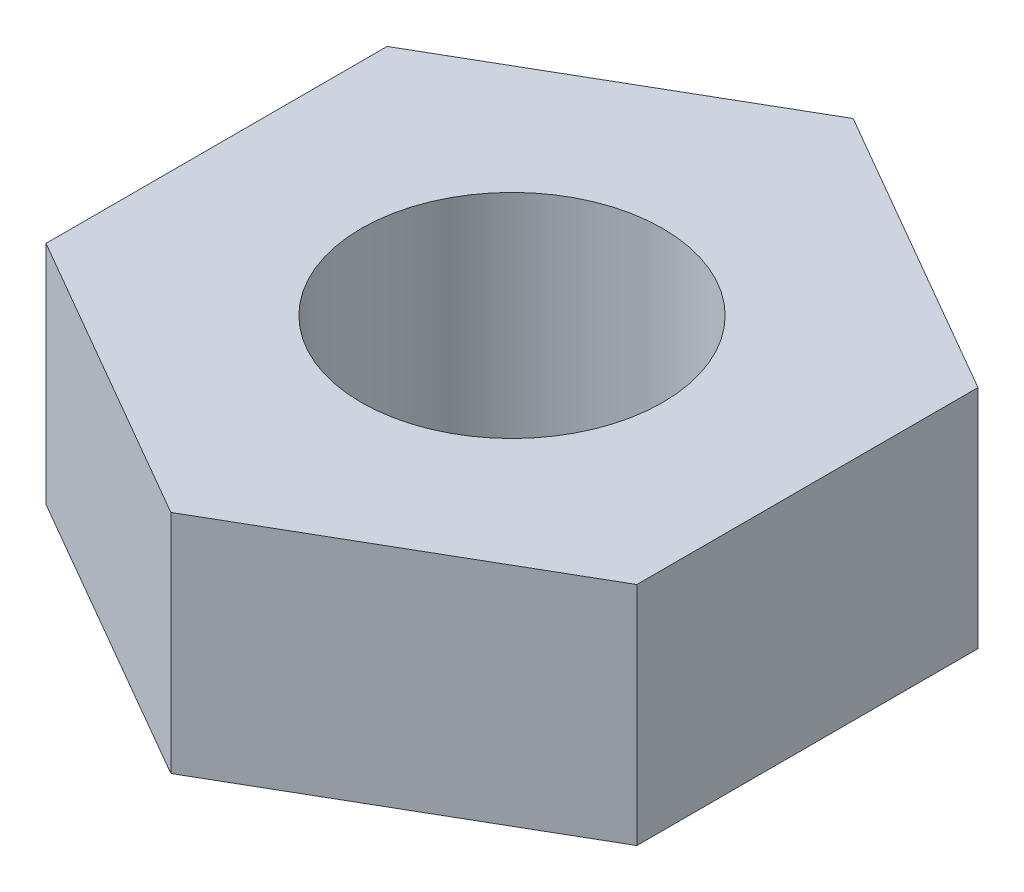
ISO-10303-21;
HEADER;
FILE_DESCRIPTION(('STEP AP214'),'2;1');
FILE_NAME('part.step','',(''),(''),'','','');
FILE_SCHEMA(('AUTOMOTIVE_DESIGN { 1 0 10303 214 1 1 1 1 }'));
ENDSEC;
DATA;
#1=APPLICATION_CONTEXT('core data for automotive mechanical design processes');
#2=APPLICATION_PROTOCOL_DEFINITION('international standard','automotive_design',2000,#1);
#3=PRODUCT_CONTEXT('',#1,'mechanical');
#4=PRODUCT('Part','Part','',(#3));
#5=PRODUCT_RELATED_PRODUCT_CATEGORY('part','',(#4));
#6=PRODUCT_DEFINITION_FORMATION('','',#4);
#7=PRODUCT_DEFINITION_CONTEXT('part definition',#1,'design');
#8=PRODUCT_DEFINITION('design','',#6,#7);
#9=PRODUCT_DEFINITION_SHAPE('','',#8);
#10=(LENGTH_UNIT() NAMED_UNIT(*) SI_UNIT(.MILLI.,.METRE.));
#11=(NAMED_UNIT(*) PLANE_ANGLE_UNIT() SI_UNIT($,.RADIAN.));
#12=(NAMED_UNIT(*) SI_UNIT($,.STERADIAN.) SOLID_ANGLE_UNIT());
#13=UNCERTAINTY_MEASURE_WITH_UNIT(LENGTH_MEASURE(1.E-05),#10,'distance_accuracy_value','');
#14=(GEOMETRIC_REPRESENTATION_CONTEXT(3) GLOBAL_UNCERTAINTY_ASSIGNED_CONTEXT((#13)) GLOBAL_UNIT_ASSIGNED_CONTEXT((#10,
#11,#12)) REPRESENTATION_CONTEXT('',''));
#15=CARTESIAN_POINT('',(0.,0.,0.));
#16=DIRECTION('',(0.,0.,1.));
#17=DIRECTION('',(1.,0.,0.));
#18=AXIS2_PLACEMENT_3D('',#15,#16,#17);
#19=CARTESIAN_POINT('',(0.,1.5,0.));
#20=DIRECTION('',(0.,1.,0.));
#21=DIRECTION('',(0.,0.,1.));
#22=AXIS2_PLACEMENT_3D('',#19,#20,#21);
#23=PLANE('',#22);
#24=DIRECTION('',(0.866025403784439,0.,0.5));
#25=VECTOR('',#24,1.);
#26=CARTESIAN_POINT('',(-1.96,1.5,1.13160652761167));
#27=LINE('',#26,#25);
#28=CARTESIAN_POINT('',(-1.96,1.5,1.13160652761167));
#29=VERTEX_POINT('',#28);
#30=CARTESIAN_POINT('',(0.,1.5,2.26321305522333));
#31=VERTEX_POINT('',#30);
#32=EDGE_CURVE('E129',#29,#31,#27,.T.);
#33=ORIENTED_EDGE('',*,*,#32,.T.);
#34=DIRECTION('',(0.866025403784439,0.,-0.5));
#35=VECTOR('',#34,1.);
#36=CARTESIAN_POINT('',(0.,1.5,2.26321305522333));
#37=LINE('',#36,#35);
#38=CARTESIAN_POINT('',(1.96,1.5,1.13160652761167));
#39=VERTEX_POINT('',#38);
#40=EDGE_CURVE('E87',#31,#39,#37,.T.);
#41=ORIENTED_EDGE('',*,*,#40,.T.);
#42=DIRECTION('',(0.,0.,-1.));
#43=VECTOR('',#42,1.);
#44=CARTESIAN_POINT('',(1.96,1.5,1.13160652761167));
#45=LINE('',#44,#43);
#46=CARTESIAN_POINT('',(1.96,1.5,-1.13160652761167));
#47=VERTEX_POINT('',#46);
#48=EDGE_CURVE('E100',#39,#47,#45,.T.);
#49=ORIENTED_EDGE('',*,*,#48,.T.);
#50=DIRECTION('',(-0.866025403784439,0.,-0.5));
#51=VECTOR('',#50,1.);
#52=CARTESIAN_POINT('',(1.96,1.5,-1.13160652761167));
#53=LINE('',#52,#51);
#54=CARTESIAN_POINT('',(0.,1.5,-2.26321305522333));
#55=VERTEX_POINT('',#54);
#56=EDGE_CURVE('E94',#47,#55,#53,.T.);
#57=ORIENTED_EDGE('',*,*,#56,.T.);
#58=DIRECTION('',(-0.866025403784439,0.,0.5));
#59=VECTOR('',#58,1.);
#60=CARTESIAN_POINT('',(0.,1.5,-2.26321305522333));
#61=LINE('',#60,#59);
#62=CARTESIAN_POINT('',(-1.96,1.5,-1.13160652761167));
#63=VERTEX_POINT('',#62);
#64=EDGE_CURVE('E98',#55,#63,#61,.T.);
#65=ORIENTED_EDGE('',*,*,#64,.T.);
#66=DIRECTION('',(0.,0.,1.));
#67=VECTOR('',#66,1.);
#68=CARTESIAN_POINT('',(-1.96,1.5,-1.13160652761167));
#69=LINE('',#68,#67);
#70=EDGE_CURVE('E50',#63,#29,#69,.T.);
#71=ORIENTED_EDGE('',*,*,#70,.T.);
#72=EDGE_LOOP('',(#33,#41,#49,#57,#65,#71));
#73=FACE_BOUND('',#72,.T.);
#74=CARTESIAN_POINT('',(0.,1.5,0.));
#75=DIRECTION('',(0.,1.,0.));
#76=DIRECTION('',(0.,0.,1.));
#77=AXIS2_PLACEMENT_3D('',#74,#75,#76);
#78=CIRCLE('',#77,1.);
#79=CARTESIAN_POINT('',(0.,1.5,1.));
#80=VERTEX_POINT('',#79);
#81=EDGE_CURVE('E122',#80,#80,#78,.T.);
#82=ORIENTED_EDGE('',*,*,#81,.F.);
#83=EDGE_LOOP('',(#82));
#84=FACE_BOUND('',#83,.T.);
#85=ADVANCED_FACE('F33',(#73,#84),#23,.T.);
#86=CARTESIAN_POINT('',(0.,0.,0.));
#87=DIRECTION('',(0.,1.,0.));
#88=DIRECTION('',(0.,0.,1.));
#89=AXIS2_PLACEMENT_3D('',#86,#87,#88);
#90=PLANE('',#89);
#91=DIRECTION('',(0.866025403784439,0.,0.5));
#92=VECTOR('',#91,1.);
#93=CARTESIAN_POINT('',(-1.96,0.,1.13160652761167));
#94=LINE('',#93,#92);
#95=CARTESIAN_POINT('',(-1.96,0.,1.13160652761167));
#96=VERTEX_POINT('',#95);
#97=CARTESIAN_POINT('',(0.,0.,2.26321305522333));
#98=VERTEX_POINT('',#97);
#99=EDGE_CURVE('E118',#96,#98,#94,.T.);
#100=ORIENTED_EDGE('',*,*,#99,.F.);
#101=DIRECTION('',(0.,0.,1.));
#102=VECTOR('',#101,1.);
#103=CARTESIAN_POINT('',(-1.96,0.,-1.13160652761167));
#104=LINE('',#103,#102);
#105=CARTESIAN_POINT('',(-1.96,0.,-1.13160652761167));
#106=VERTEX_POINT('',#105);
#107=EDGE_CURVE('E79',#106,#96,#104,.T.);
#108=ORIENTED_EDGE('',*,*,#107,.F.);
#109=DIRECTION('',(-0.866025403784439,0.,0.5));
#110=VECTOR('',#109,1.);
#111=CARTESIAN_POINT('',(0.,0.,-2.26321305522333));
#112=LINE('',#111,#110);
#113=CARTESIAN_POINT('',(0.,0.,-2.26321305522333));
#114=VERTEX_POINT('',#113);
#115=EDGE_CURVE('E73',#114,#106,#112,.T.);
#116=ORIENTED_EDGE('',*,*,#115,.F.);
#117=DIRECTION('',(-0.866025403784439,0.,-0.5));
#118=VECTOR('',#117,1.);
#119=CARTESIAN_POINT('',(1.96,0.,-1.13160652761167));
#120=LINE('',#119,#118);
#121=CARTESIAN_POINT('',(1.96,0.,-1.13160652761167));
#122=VERTEX_POINT('',#121);
#123=EDGE_CURVE('E108',#122,#114,#120,.T.);
#124=ORIENTED_EDGE('',*,*,#123,.F.);
#125=DIRECTION('',(0.,0.,-1.));
#126=VECTOR('',#125,1.);
#127=CARTESIAN_POINT('',(1.96,0.,1.13160652761167));
#128=LINE('',#127,#126);
#129=CARTESIAN_POINT('',(1.96,0.,1.13160652761167));
#130=VERTEX_POINT('',#129);
#131=EDGE_CURVE('E124',#130,#122,#128,.T.);
#132=ORIENTED_EDGE('',*,*,#131,.F.);
#133=DIRECTION('',(0.866025403784439,0.,-0.5));
#134=VECTOR('',#133,1.);
#135=CARTESIAN_POINT('',(0.,0.,2.26321305522333));
#136=LINE('',#135,#134);
#137=EDGE_CURVE('E121',#98,#130,#136,.T.);
#138=ORIENTED_EDGE('',*,*,#137,.F.);
#139=EDGE_LOOP('',(#100,#108,#116,#124,#132,#138));
#140=FACE_BOUND('',#139,.T.);
#141=CARTESIAN_POINT('',(0.,0.,0.));
#142=DIRECTION('',(0.,1.,0.));
#143=DIRECTION('',(0.,0.,1.));
#144=AXIS2_PLACEMENT_3D('',#141,#142,#143);
#145=CIRCLE('',#144,1.);
#146=CARTESIAN_POINT('',(0.,0.,1.));
#147=VERTEX_POINT('',#146);
#148=EDGE_CURVE('E222',#147,#147,#145,.T.);
#149=ORIENTED_EDGE('',*,*,#148,.T.);
#150=EDGE_LOOP('',(#149));
#151=FACE_BOUND('',#150,.T.);
#152=ADVANCED_FACE('F138',(#140,#151),#90,.F.);
#153=CARTESIAN_POINT('',(-1.96,1.5,1.13160652761167));
#154=DIRECTION('',(0.5,0.,-0.866025403784438));
#155=DIRECTION('',(-0.866025403784439,0.,-0.5));
#156=AXIS2_PLACEMENT_3D('',#153,#154,#155);
#157=PLANE('',#156);
#158=ORIENTED_EDGE('',*,*,#99,.T.);
#159=DIRECTION('',(0.,-1.,0.));
#160=VECTOR('',#159,1.);
#161=CARTESIAN_POINT('',(0.,1.5,2.26321305522333));
#162=LINE('',#161,#160);
#163=EDGE_CURVE('E11',#31,#98,#162,.T.);
#164=ORIENTED_EDGE('',*,*,#163,.F.);
#165=ORIENTED_EDGE('',*,*,#32,.F.);
#166=DIRECTION('',(0.,-1.,0.));
#167=VECTOR('',#166,1.);
#168=CARTESIAN_POINT('',(-1.96,1.5,1.13160652761167));
#169=LINE('',#168,#167);
#170=EDGE_CURVE('E114',#29,#96,#169,.T.);
#171=ORIENTED_EDGE('',*,*,#170,.T.);
#172=EDGE_LOOP('',(#158,#164,#165,#171));
#173=FACE_BOUND('',#172,.T.);
#174=ADVANCED_FACE('F35',(#173),#157,.F.);
#175=CARTESIAN_POINT('',(0.,1.5,2.26321305522333));
#176=DIRECTION('',(-0.5,0.,-0.866025403784439));
#177=DIRECTION('',(-0.866025403784439,0.,0.5));
#178=AXIS2_PLACEMENT_3D('',#175,#176,#177);
#179=PLANE('',#178);
#180=ORIENTED_EDGE('',*,*,#137,.T.);
#181=DIRECTION('',(0.,-1.,0.));
#182=VECTOR('',#181,1.);
#183=CARTESIAN_POINT('',(1.96,1.5,1.13160652761167));
#184=LINE('',#183,#182);
#185=EDGE_CURVE('E42',#39,#130,#184,.T.);
#186=ORIENTED_EDGE('',*,*,#185,.F.);
#187=ORIENTED_EDGE('',*,*,#40,.F.);
#188=ORIENTED_EDGE('',*,*,#163,.T.);
#189=EDGE_LOOP('',(#180,#186,#187,#188));
#190=FACE_BOUND('',#189,.T.);
#191=ADVANCED_FACE('F163',(#190),#179,.F.);
#192=CARTESIAN_POINT('',(1.96,1.5,1.13160652761167));
#193=DIRECTION('',(-1.,0.,0.));
#194=DIRECTION('',(0.,0.,1.));
#195=AXIS2_PLACEMENT_3D('',#192,#193,#194);
#196=PLANE('',#195);
#197=ORIENTED_EDGE('',*,*,#131,.T.);
#198=DIRECTION('',(0.,-1.,0.));
#199=VECTOR('',#198,1.);
#200=CARTESIAN_POINT('',(1.96,1.5,-1.13160652761167));
#201=LINE('',#200,#199);
#202=EDGE_CURVE('E109',#47,#122,#201,.T.);
#203=ORIENTED_EDGE('',*,*,#202,.F.);
#204=ORIENTED_EDGE('',*,*,#48,.F.);
#205=ORIENTED_EDGE('',*,*,#185,.T.);
#206=EDGE_LOOP('',(#197,#203,#204,#205));
#207=FACE_BOUND('',#206,.T.);
#208=ADVANCED_FACE('F135',(#207),#196,.F.);
#209=CARTESIAN_POINT('',(1.96,1.5,-1.13160652761167));
#210=DIRECTION('',(-0.5,0.,0.866025403784439));
#211=DIRECTION('',(0.866025403784439,0.,0.5));
#212=AXIS2_PLACEMENT_3D('',#209,#210,#211);
#213=PLANE('',#212);
#214=ORIENTED_EDGE('',*,*,#123,.T.);
#215=DIRECTION('',(0.,-1.,0.));
#216=VECTOR('',#215,1.);
#217=CARTESIAN_POINT('',(0.,1.5,-2.26321305522333));
#218=LINE('',#217,#216);
#219=EDGE_CURVE('E105',#55,#114,#218,.T.);
#220=ORIENTED_EDGE('',*,*,#219,.F.);
#221=ORIENTED_EDGE('',*,*,#56,.F.);
#222=ORIENTED_EDGE('',*,*,#202,.T.);
#223=EDGE_LOOP('',(#214,#220,#221,#222));
#224=FACE_BOUND('',#223,.T.);
#225=ADVANCED_FACE('F106',(#224),#213,.F.);
#226=CARTESIAN_POINT('',(0.,1.5,-2.26321305522333));
#227=DIRECTION('',(0.5,0.,0.866025403784439));
#228=DIRECTION('',(0.866025403784439,0.,-0.5));
#229=AXIS2_PLACEMENT_3D('',#226,#227,#228);
#230=PLANE('',#229);
#231=ORIENTED_EDGE('',*,*,#115,.T.);
#232=DIRECTION('',(0.,-1.,0.));
#233=VECTOR('',#232,1.);
#234=CARTESIAN_POINT('',(-1.96,1.5,-1.13160652761167));
#235=LINE('',#234,#233);
#236=EDGE_CURVE('E110',#63,#106,#235,.T.);
#237=ORIENTED_EDGE('',*,*,#236,.F.);
#238=ORIENTED_EDGE('',*,*,#64,.F.);
#239=ORIENTED_EDGE('',*,*,#219,.T.);
#240=EDGE_LOOP('',(#231,#237,#238,#239));
#241=FACE_BOUND('',#240,.T.);
#242=ADVANCED_FACE('F112',(#241),#230,.F.);
#243=CARTESIAN_POINT('',(-1.96,1.5,-1.13160652761167));
#244=DIRECTION('',(1.,0.,0.));
#245=DIRECTION('',(0.,0.,-1.));
#246=AXIS2_PLACEMENT_3D('',#243,#244,#245);
#247=PLANE('',#246);
#248=ORIENTED_EDGE('',*,*,#107,.T.);
#249=ORIENTED_EDGE('',*,*,#170,.F.);
#250=ORIENTED_EDGE('',*,*,#70,.F.);
#251=ORIENTED_EDGE('',*,*,#236,.T.);
#252=EDGE_LOOP('',(#248,#249,#250,#251));
#253=FACE_BOUND('',#252,.T.);
#254=ADVANCED_FACE('F143',(#253),#247,.F.);
#255=CARTESIAN_POINT('',(0.,1.5,0.));
#256=DIRECTION('',(0.,-1.,0.));
#257=DIRECTION('',(0.,0.,-1.));
#258=AXIS2_PLACEMENT_3D('',#255,#256,#257);
#259=CYLINDRICAL_SURFACE('',#258,1.);
#260=ORIENTED_EDGE('',*,*,#81,.T.);
#261=EDGE_LOOP('',(#260));
#262=FACE_BOUND('',#261,.T.);
#263=ORIENTED_EDGE('',*,*,#148,.F.);
#264=EDGE_LOOP('',(#263));
#265=FACE_BOUND('',#264,.T.);
#266=ADVANCED_FACE('F145',(#262,#265),#259,.F.);
#267=CLOSED_SHELL('',(#85,#152,#174,#191,#208,#225,#242,#254,#266));
#268=MANIFOLD_SOLID_BREP('B2',#267);
#269=ADVANCED_BREP_SHAPE_REPRESENTATION('',(#18,#268),#14);
#270=SHAPE_DEFINITION_REPRESENTATION(#9,#269);
ENDSEC;
END-ISO-10303-21;
